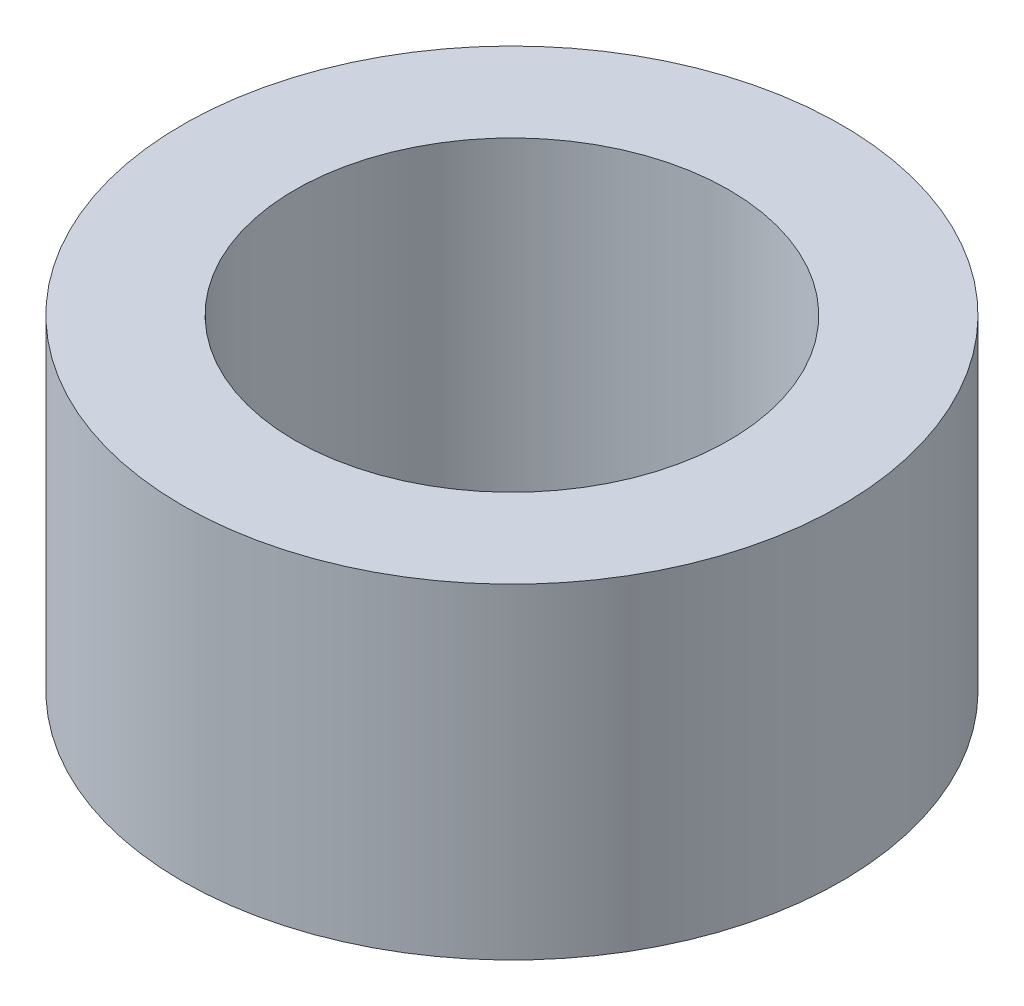
ISO-10303-21;
HEADER;
FILE_DESCRIPTION(('STEP AP214'),'2;1');
FILE_NAME('part.step','',(''),(''),'','','');
FILE_SCHEMA(('AUTOMOTIVE_DESIGN { 1 0 10303 214 1 1 1 1 }'));
ENDSEC;
DATA;
#1=APPLICATION_CONTEXT('core data for automotive mechanical design processes');
#2=APPLICATION_PROTOCOL_DEFINITION('international standard','automotive_design',2000,#1);
#3=PRODUCT_CONTEXT('',#1,'mechanical');
#4=PRODUCT('Part','Part','',(#3));
#5=PRODUCT_RELATED_PRODUCT_CATEGORY('part','',(#4));
#6=PRODUCT_DEFINITION_FORMATION('','',#4);
#7=PRODUCT_DEFINITION_CONTEXT('part definition',#1,'design');
#8=PRODUCT_DEFINITION('design','',#6,#7);
#9=PRODUCT_DEFINITION_SHAPE('','',#8);
#10=(LENGTH_UNIT() NAMED_UNIT(*) SI_UNIT(.MILLI.,.METRE.));
#11=(NAMED_UNIT(*) PLANE_ANGLE_UNIT() SI_UNIT($,.RADIAN.));
#12=(NAMED_UNIT(*) SI_UNIT($,.STERADIAN.) SOLID_ANGLE_UNIT());
#13=UNCERTAINTY_MEASURE_WITH_UNIT(LENGTH_MEASURE(1.E-05),#10,'distance_accuracy_value','');
#14=(GEOMETRIC_REPRESENTATION_CONTEXT(3) GLOBAL_UNCERTAINTY_ASSIGNED_CONTEXT((#13)) GLOBAL_UNIT_ASSIGNED_CONTEXT((#10,
#11,#12)) REPRESENTATION_CONTEXT('',''));
#15=CARTESIAN_POINT('',(0.,0.,0.));
#16=DIRECTION('',(0.,0.,1.));
#17=DIRECTION('',(1.,0.,0.));
#18=AXIS2_PLACEMENT_3D('',#15,#16,#17);
#19=CARTESIAN_POINT('',(0.,6.,0.));
#20=DIRECTION('',(0.,1.,0.));
#21=DIRECTION('',(0.,0.,1.));
#22=AXIS2_PLACEMENT_3D('',#19,#20,#21);
#23=PLANE('',#22);
#24=CARTESIAN_POINT('',(0.,6.,0.));
#25=DIRECTION('',(0.,1.,0.));
#26=DIRECTION('',(0.,0.,1.));
#27=AXIS2_PLACEMENT_3D('',#24,#25,#26);
#28=CIRCLE('',#27,6.075);
#29=CARTESIAN_POINT('',(0.,6.,6.075));
#30=VERTEX_POINT('',#29);
#31=EDGE_CURVE('E10',#30,#30,#28,.T.);
#32=ORIENTED_EDGE('',*,*,#31,.T.);
#33=EDGE_LOOP('',(#32));
#34=FACE_BOUND('',#33,.T.);
#35=CARTESIAN_POINT('',(0.,6.,0.));
#36=DIRECTION('',(0.,1.,0.));
#37=DIRECTION('',(0.,0.,1.));
#38=AXIS2_PLACEMENT_3D('',#35,#36,#37);
#39=CIRCLE('',#38,4.);
#40=CARTESIAN_POINT('',(0.,6.,4.));
#41=VERTEX_POINT('',#40);
#42=EDGE_CURVE('E50',#41,#41,#39,.T.);
#43=ORIENTED_EDGE('',*,*,#42,.F.);
#44=EDGE_LOOP('',(#43));
#45=FACE_BOUND('',#44,.T.);
#46=ADVANCED_FACE('F37',(#34,#45),#23,.T.);
#47=CARTESIAN_POINT('',(0.,0.,0.));
#48=DIRECTION('',(0.,1.,0.));
#49=DIRECTION('',(0.,0.,1.));
#50=AXIS2_PLACEMENT_3D('',#47,#48,#49);
#51=PLANE('',#50);
#52=CARTESIAN_POINT('',(0.,0.,0.));
#53=DIRECTION('',(0.,1.,0.));
#54=DIRECTION('',(0.,0.,1.));
#55=AXIS2_PLACEMENT_3D('',#52,#53,#54);
#56=CIRCLE('',#55,6.075);
#57=CARTESIAN_POINT('',(0.,0.,6.075));
#58=VERTEX_POINT('',#57);
#59=EDGE_CURVE('E41',#58,#58,#56,.T.);
#60=ORIENTED_EDGE('',*,*,#59,.F.);
#61=EDGE_LOOP('',(#60));
#62=FACE_BOUND('',#61,.T.);
#63=CARTESIAN_POINT('',(0.,0.,0.));
#64=DIRECTION('',(0.,1.,0.));
#65=DIRECTION('',(0.,0.,1.));
#66=AXIS2_PLACEMENT_3D('',#63,#64,#65);
#67=CIRCLE('',#66,4.);
#68=CARTESIAN_POINT('',(0.,0.,4.));
#69=VERTEX_POINT('',#68);
#70=EDGE_CURVE('E52',#69,#69,#67,.T.);
#71=ORIENTED_EDGE('',*,*,#70,.T.);
#72=EDGE_LOOP('',(#71));
#73=FACE_BOUND('',#72,.T.);
#74=ADVANCED_FACE('F64',(#62,#73),#51,.F.);
#75=CARTESIAN_POINT('',(0.,6.,0.));
#76=DIRECTION('',(0.,-1.,0.));
#77=DIRECTION('',(0.,0.,-1.));
#78=AXIS2_PLACEMENT_3D('',#75,#76,#77);
#79=CYLINDRICAL_SURFACE('',#78,6.075);
#80=ORIENTED_EDGE('',*,*,#31,.F.);
#81=EDGE_LOOP('',(#80));
#82=FACE_BOUND('',#81,.T.);
#83=ORIENTED_EDGE('',*,*,#59,.T.);
#84=EDGE_LOOP('',(#83));
#85=FACE_BOUND('',#84,.T.);
#86=ADVANCED_FACE('F39',(#82,#85),#79,.T.);
#87=CARTESIAN_POINT('',(0.,6.,0.));
#88=DIRECTION('',(0.,-1.,0.));
#89=DIRECTION('',(0.,0.,-1.));
#90=AXIS2_PLACEMENT_3D('',#87,#88,#89);
#91=CYLINDRICAL_SURFACE('',#90,4.);
#92=ORIENTED_EDGE('',*,*,#42,.T.);
#93=EDGE_LOOP('',(#92));
#94=FACE_BOUND('',#93,.T.);
#95=ORIENTED_EDGE('',*,*,#70,.F.);
#96=EDGE_LOOP('',(#95));
#97=FACE_BOUND('',#96,.T.);
#98=ADVANCED_FACE('F60',(#94,#97),#91,.F.);
#99=CLOSED_SHELL('',(#46,#74,#86,#98));
#100=MANIFOLD_SOLID_BREP('B2',#99);
#101=ADVANCED_BREP_SHAPE_REPRESENTATION('',(#18,#100),#14);
#102=SHAPE_DEFINITION_REPRESENTATION(#9,#101);
ENDSEC;
END-ISO-10303-21;
